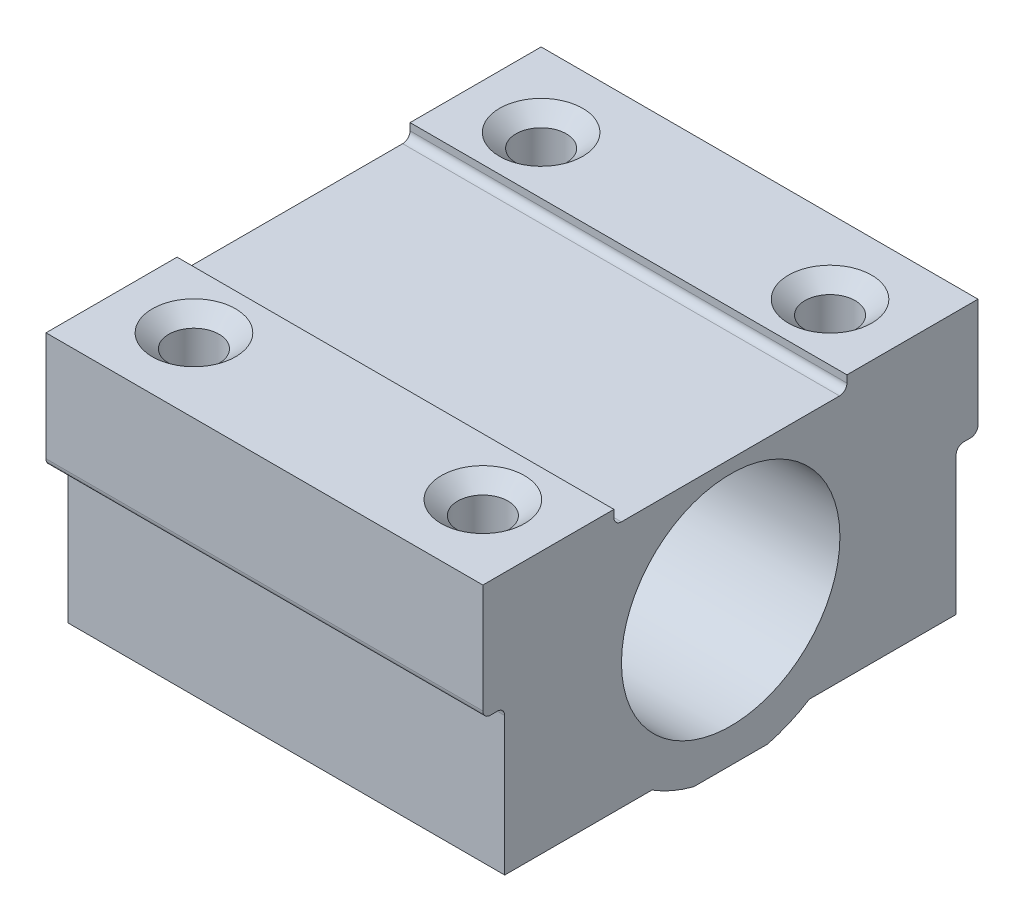
ISO-10303-21;
HEADER;
FILE_DESCRIPTION(('STEP AP214'),'2;1');
FILE_NAME('part.step','',(''),(''),'','','');
FILE_SCHEMA(('AUTOMOTIVE_DESIGN { 1 0 10303 214 1 1 1 1 }'));
ENDSEC;
DATA;
#1=APPLICATION_CONTEXT('core data for automotive mechanical design processes');
#2=APPLICATION_PROTOCOL_DEFINITION('international standard','automotive_design',2000,#1);
#3=PRODUCT_CONTEXT('',#1,'mechanical');
#4=PRODUCT('Part','Part','',(#3));
#5=PRODUCT_RELATED_PRODUCT_CATEGORY('part','',(#4));
#6=PRODUCT_DEFINITION_FORMATION('','',#4);
#7=PRODUCT_DEFINITION_CONTEXT('part definition',#1,'design');
#8=PRODUCT_DEFINITION('design','',#6,#7);
#9=PRODUCT_DEFINITION_SHAPE('','',#8);
#10=(LENGTH_UNIT() NAMED_UNIT(*) SI_UNIT(.MILLI.,.METRE.));
#11=(NAMED_UNIT(*) PLANE_ANGLE_UNIT() SI_UNIT($,.RADIAN.));
#12=(NAMED_UNIT(*) SI_UNIT($,.STERADIAN.) SOLID_ANGLE_UNIT());
#13=UNCERTAINTY_MEASURE_WITH_UNIT(LENGTH_MEASURE(1.E-05),#10,'distance_accuracy_value','');
#14=(GEOMETRIC_REPRESENTATION_CONTEXT(3) GLOBAL_UNCERTAINTY_ASSIGNED_CONTEXT((#13)) GLOBAL_UNIT_ASSIGNED_CONTEXT((#10,
#11,#12)) REPRESENTATION_CONTEXT('',''));
#15=CARTESIAN_POINT('',(0.,0.,0.));
#16=DIRECTION('',(0.,0.,1.));
#17=DIRECTION('',(1.,0.,0.));
#18=AXIS2_PLACEMENT_3D('',#15,#16,#17);
#19=CARTESIAN_POINT('',(30.,8.,0.));
#20=DIRECTION('',(0.,-1.,0.));
#21=DIRECTION('',(0.,0.,-1.));
#22=AXIS2_PLACEMENT_3D('',#19,#20,#21);
#23=PLANE('',#22);
#24=CARTESIAN_POINT('',(24.92,8.,-5.08));
#25=DIRECTION('',(0.,1.,0.));
#26=DIRECTION('',(0.,0.,1.));
#27=AXIS2_PLACEMENT_3D('',#24,#25,#26);
#28=CIRCLE('',#27,2.8575);
#29=CARTESIAN_POINT('',(24.92,8.,-2.2225));
#30=VERTEX_POINT('',#29);
#31=EDGE_CURVE('E225',#30,#30,#28,.T.);
#32=ORIENTED_EDGE('',*,*,#31,.F.);
#33=EDGE_LOOP('',(#32));
#34=FACE_BOUND('',#33,.T.);
#35=DIRECTION('',(0.,0.,1.));
#36=VECTOR('',#35,1.);
#37=CARTESIAN_POINT('',(0.,8.,0.));
#38=LINE('',#37,#36);
#39=CARTESIAN_POINT('',(0.,8.,-9.));
#40=VERTEX_POINT('',#39);
#41=CARTESIAN_POINT('',(0.,8.,0.));
#42=VERTEX_POINT('',#41);
#43=EDGE_CURVE('E320',#40,#42,#38,.T.);
#44=ORIENTED_EDGE('',*,*,#43,.T.);
#45=DIRECTION('',(-1.,0.,0.));
#46=VECTOR('',#45,1.);
#47=CARTESIAN_POINT('',(30.,8.,0.));
#48=LINE('',#47,#46);
#49=CARTESIAN_POINT('',(30.,8.,0.));
#50=VERTEX_POINT('',#49);
#51=EDGE_CURVE('E288',#50,#42,#48,.T.);
#52=ORIENTED_EDGE('',*,*,#51,.F.);
#53=DIRECTION('',(0.,0.,1.));
#54=VECTOR('',#53,1.);
#55=CARTESIAN_POINT('',(30.,8.,0.));
#56=LINE('',#55,#54);
#57=CARTESIAN_POINT('',(30.,8.,-9.));
#58=VERTEX_POINT('',#57);
#59=EDGE_CURVE('E285',#58,#50,#56,.T.);
#60=ORIENTED_EDGE('',*,*,#59,.F.);
#61=DIRECTION('',(-1.,0.,0.));
#62=VECTOR('',#61,1.);
#63=CARTESIAN_POINT('',(30.,8.,-9.));
#64=LINE('',#63,#62);
#65=EDGE_CURVE('E326',#58,#40,#64,.T.);
#66=ORIENTED_EDGE('',*,*,#65,.T.);
#67=EDGE_LOOP('',(#44,#52,#60,#66));
#68=FACE_BOUND('',#67,.T.);
#69=CARTESIAN_POINT('',(5.08,8.,-5.08));
#70=DIRECTION('',(0.,1.,0.));
#71=DIRECTION('',(0.,0.,1.));
#72=AXIS2_PLACEMENT_3D('',#69,#70,#71);
#73=CIRCLE('',#72,2.8575);
#74=CARTESIAN_POINT('',(5.08,8.,-2.2225));
#75=VERTEX_POINT('',#74);
#76=EDGE_CURVE('E234',#75,#75,#73,.T.);
#77=ORIENTED_EDGE('',*,*,#76,.F.);
#78=EDGE_LOOP('',(#77));
#79=FACE_BOUND('',#78,.T.);
#80=ADVANCED_FACE('F39',(#34,#68,#79),#23,.F.);
#81=CARTESIAN_POINT('',(30.,-1.398,-17.018));
#82=DIRECTION('',(1.,0.,0.));
#83=DIRECTION('',(0.,0.,-1.));
#84=AXIS2_PLACEMENT_3D('',#81,#82,#83);
#85=PLANE('',#84);
#86=DIRECTION('',(0.,0.,-1.));
#87=VECTOR('',#86,1.);
#88=CARTESIAN_POINT('',(30.,0.,-32.5));
#89=LINE('',#88,#87);
#90=CARTESIAN_POINT('',(30.,0.,-33.008));
#91=VERTEX_POINT('',#90);
#92=CARTESIAN_POINT('',(30.,0.,-33.492));
#93=VERTEX_POINT('',#92);
#94=EDGE_CURVE('E270',#91,#93,#89,.T.);
#95=ORIENTED_EDGE('',*,*,#94,.T.);
#96=CARTESIAN_POINT('',(30.,0.508,-33.492));
#97=DIRECTION('',(1.,0.,0.));
#98=DIRECTION('',(0.,0.,-1.));
#99=AXIS2_PLACEMENT_3D('',#96,#97,#98);
#100=CIRCLE('',#99,0.508);
#101=CARTESIAN_POINT('',(30.,0.508,-34.));
#102=VERTEX_POINT('',#101);
#103=EDGE_CURVE('E377',#93,#102,#100,.T.);
#104=ORIENTED_EDGE('',*,*,#103,.T.);
#105=DIRECTION('',(0.,1.,0.));
#106=VECTOR('',#105,1.);
#107=CARTESIAN_POINT('',(30.,0.,-34.));
#108=LINE('',#107,#106);
#109=CARTESIAN_POINT('',(30.,8.,-34.));
#110=VERTEX_POINT('',#109);
#111=EDGE_CURVE('E273',#102,#110,#108,.T.);
#112=ORIENTED_EDGE('',*,*,#111,.T.);
#113=DIRECTION('',(0.,0.,1.));
#114=VECTOR('',#113,1.);
#115=CARTESIAN_POINT('',(30.,8.,-34.));
#116=LINE('',#115,#114);
#117=CARTESIAN_POINT('',(30.,8.,-25.));
#118=VERTEX_POINT('',#117);
#119=EDGE_CURVE('E275',#110,#118,#116,.T.);
#120=ORIENTED_EDGE('',*,*,#119,.T.);
#121=DIRECTION('',(0.,-1.,0.));
#122=VECTOR('',#121,1.);
#123=CARTESIAN_POINT('',(30.,7.,-25.));
#124=LINE('',#123,#122);
#125=CARTESIAN_POINT('',(30.,7.508,-25.));
#126=VERTEX_POINT('',#125);
#127=EDGE_CURVE('E277',#118,#126,#124,.T.);
#128=ORIENTED_EDGE('',*,*,#127,.T.);
#129=CARTESIAN_POINT('',(30.,7.508,-24.492));
#130=DIRECTION('',(1.,0.,0.));
#131=DIRECTION('',(0.,0.,-1.));
#132=AXIS2_PLACEMENT_3D('',#129,#130,#131);
#133=CIRCLE('',#132,0.508);
#134=CARTESIAN_POINT('',(30.,7.,-24.492));
#135=VERTEX_POINT('',#134);
#136=EDGE_CURVE('E392',#126,#135,#133,.F.);
#137=ORIENTED_EDGE('',*,*,#136,.T.);
#138=DIRECTION('',(0.,0.,1.));
#139=VECTOR('',#138,1.);
#140=CARTESIAN_POINT('',(30.,7.,-9.));
#141=LINE('',#140,#139);
#142=CARTESIAN_POINT('',(30.,7.,-9.508));
#143=VERTEX_POINT('',#142);
#144=EDGE_CURVE('E280',#135,#143,#141,.T.);
#145=ORIENTED_EDGE('',*,*,#144,.T.);
#146=CARTESIAN_POINT('',(30.,7.508,-9.508));
#147=DIRECTION('',(1.,0.,0.));
#148=DIRECTION('',(0.,0.,-1.));
#149=AXIS2_PLACEMENT_3D('',#146,#147,#148);
#150=CIRCLE('',#149,0.508);
#151=CARTESIAN_POINT('',(30.,7.508,-9.));
#152=VERTEX_POINT('',#151);
#153=EDGE_CURVE('E396',#143,#152,#150,.F.);
#154=ORIENTED_EDGE('',*,*,#153,.T.);
#155=DIRECTION('',(0.,1.,0.));
#156=VECTOR('',#155,1.);
#157=CARTESIAN_POINT('',(30.,7.,-9.));
#158=LINE('',#157,#156);
#159=EDGE_CURVE('E283',#152,#58,#158,.T.);
#160=ORIENTED_EDGE('',*,*,#159,.T.);
#161=ORIENTED_EDGE('',*,*,#59,.T.);
#162=DIRECTION('',(0.,-1.,0.));
#163=VECTOR('',#162,1.);
#164=CARTESIAN_POINT('',(30.,0.,0.));
#165=LINE('',#164,#163);
#166=CARTESIAN_POINT('',(30.,0.508,0.));
#167=VERTEX_POINT('',#166);
#168=EDGE_CURVE('E250',#50,#167,#165,.T.);
#169=ORIENTED_EDGE('',*,*,#168,.T.);
#170=CARTESIAN_POINT('',(30.,0.508,-0.508));
#171=DIRECTION('',(1.,0.,0.));
#172=DIRECTION('',(0.,0.,-1.));
#173=AXIS2_PLACEMENT_3D('',#170,#171,#172);
#174=CIRCLE('',#173,0.508);
#175=CARTESIAN_POINT('',(30.,0.,-0.508));
#176=VERTEX_POINT('',#175);
#177=EDGE_CURVE('E375',#167,#176,#174,.T.);
#178=ORIENTED_EDGE('',*,*,#177,.T.);
#179=DIRECTION('',(0.,0.,-1.));
#180=VECTOR('',#179,1.);
#181=CARTESIAN_POINT('',(30.,0.,0.));
#182=LINE('',#181,#180);
#183=CARTESIAN_POINT('',(30.,0.,-0.992000000000001));
#184=VERTEX_POINT('',#183);
#185=EDGE_CURVE('E253',#176,#184,#182,.T.);
#186=ORIENTED_EDGE('',*,*,#185,.T.);
#187=CARTESIAN_POINT('',(30.,-0.508,-0.992000000000001));
#188=DIRECTION('',(1.,0.,0.));
#189=DIRECTION('',(0.,0.,-1.));
#190=AXIS2_PLACEMENT_3D('',#187,#188,#189);
#191=CIRCLE('',#190,0.508);
#192=CARTESIAN_POINT('',(30.,-0.508,-1.5));
#193=VERTEX_POINT('',#192);
#194=EDGE_CURVE('E11',#184,#193,#191,.F.);
#195=ORIENTED_EDGE('',*,*,#194,.T.);
#196=DIRECTION('',(0.,-1.,0.));
#197=VECTOR('',#196,1.);
#198=CARTESIAN_POINT('',(30.,0.,-1.5));
#199=LINE('',#198,#197);
#200=CARTESIAN_POINT('',(30.,-10.,-1.5));
#201=VERTEX_POINT('',#200);
#202=EDGE_CURVE('E256',#193,#201,#199,.T.);
#203=ORIENTED_EDGE('',*,*,#202,.T.);
#204=DIRECTION('',(0.,0.,-1.));
#205=VECTOR('',#204,1.);
#206=CARTESIAN_POINT('',(30.,-10.,-1.5));
#207=LINE('',#206,#205);
#208=CARTESIAN_POINT('',(30.,-10.,-11.6114117967058));
#209=VERTEX_POINT('',#208);
#210=EDGE_CURVE('E258',#201,#209,#207,.T.);
#211=ORIENTED_EDGE('',*,*,#210,.T.);
#212=CARTESIAN_POINT('',(30.,-1.398,-17.018));
#213=DIRECTION('',(1.,0.,0.));
#214=DIRECTION('',(0.,0.,-1.));
#215=AXIS2_PLACEMENT_3D('',#212,#213,#214);
#216=CIRCLE('',#215,10.16);
#217=CARTESIAN_POINT('',(30.,-11.2375684973966,-14.4865000918347));
#218=VERTEX_POINT('',#217);
#219=EDGE_CURVE('E260',#209,#218,#216,.T.);
#220=ORIENTED_EDGE('',*,*,#219,.T.);
#221=DIRECTION('',(0.,0.,-1.));
#222=VECTOR('',#221,1.);
#223=CARTESIAN_POINT('',(30.,-11.2375684973966,-14.4865000918347));
#224=LINE('',#223,#222);
#225=CARTESIAN_POINT('',(30.,-11.2375684973966,-19.5494999081653));
#226=VERTEX_POINT('',#225);
#227=EDGE_CURVE('E262',#218,#226,#224,.T.);
#228=ORIENTED_EDGE('',*,*,#227,.T.);
#229=CARTESIAN_POINT('',(30.,-1.398,-17.018));
#230=DIRECTION('',(1.,0.,0.));
#231=DIRECTION('',(0.,0.,-1.));
#232=AXIS2_PLACEMENT_3D('',#229,#230,#231);
#233=CIRCLE('',#232,10.16);
#234=CARTESIAN_POINT('',(30.,-10.,-22.4245882032942));
#235=VERTEX_POINT('',#234);
#236=EDGE_CURVE('E264',#226,#235,#233,.T.);
#237=ORIENTED_EDGE('',*,*,#236,.T.);
#238=DIRECTION('',(0.,0.,-1.));
#239=VECTOR('',#238,1.);
#240=CARTESIAN_POINT('',(30.,-10.,-22.4245882032942));
#241=LINE('',#240,#239);
#242=CARTESIAN_POINT('',(30.,-10.,-32.5));
#243=VERTEX_POINT('',#242);
#244=EDGE_CURVE('E266',#235,#243,#241,.T.);
#245=ORIENTED_EDGE('',*,*,#244,.T.);
#246=DIRECTION('',(0.,1.,0.));
#247=VECTOR('',#246,1.);
#248=CARTESIAN_POINT('',(30.,0.,-32.5));
#249=LINE('',#248,#247);
#250=CARTESIAN_POINT('',(30.,-0.508,-32.5));
#251=VERTEX_POINT('',#250);
#252=EDGE_CURVE('E268',#243,#251,#249,.T.);
#253=ORIENTED_EDGE('',*,*,#252,.T.);
#254=CARTESIAN_POINT('',(30.,-0.508,-33.008));
#255=DIRECTION('',(1.,0.,0.));
#256=DIRECTION('',(0.,0.,-1.));
#257=AXIS2_PLACEMENT_3D('',#254,#255,#256);
#258=CIRCLE('',#257,0.508);
#259=EDGE_CURVE('E400',#251,#91,#258,.F.);
#260=ORIENTED_EDGE('',*,*,#259,.T.);
#261=EDGE_LOOP('',(#95,#104,#112,#120,#128,#137,#145,#154,#160,#161,#169,#178,#186,#195,#203,
#211,#220,#228,#237,#245,#253,#260));
#262=FACE_BOUND('',#261,.T.);
#263=CARTESIAN_POINT('',(30.,-1.398,-17.018));
#264=DIRECTION('',(1.,0.,0.));
#265=DIRECTION('',(0.,0.,-1.));
#266=AXIS2_PLACEMENT_3D('',#263,#264,#265);
#267=CIRCLE('',#266,7.5);
#268=CARTESIAN_POINT('',(30.,-1.398,-24.518));
#269=VERTEX_POINT('',#268);
#270=EDGE_CURVE('E244',#269,#269,#267,.T.);
#271=ORIENTED_EDGE('',*,*,#270,.F.);
#272=EDGE_LOOP('',(#271));
#273=FACE_BOUND('',#272,.T.);
#274=ADVANCED_FACE('F419',(#262,#273),#85,.T.);
#275=CARTESIAN_POINT('',(0.,-1.398,-17.018));
#276=DIRECTION('',(1.,0.,0.));
#277=DIRECTION('',(0.,0.,-1.));
#278=AXIS2_PLACEMENT_3D('',#275,#276,#277);
#279=PLANE('',#278);
#280=DIRECTION('',(0.,1.,0.));
#281=VECTOR('',#280,1.);
#282=CARTESIAN_POINT('',(0.,7.49375,-34.));
#283=LINE('',#282,#281);
#284=CARTESIAN_POINT('',(0.,0.508,-34.));
#285=VERTEX_POINT('',#284);
#286=CARTESIAN_POINT('',(0.,8.,-34.));
#287=VERTEX_POINT('',#286);
#288=EDGE_CURVE('E308',#285,#287,#283,.T.);
#289=ORIENTED_EDGE('',*,*,#288,.F.);
#290=CARTESIAN_POINT('',(0.,0.508,-33.492));
#291=DIRECTION('',(1.,0.,0.));
#292=DIRECTION('',(0.,0.,-1.));
#293=AXIS2_PLACEMENT_3D('',#290,#291,#292);
#294=CIRCLE('',#293,0.508);
#295=CARTESIAN_POINT('',(0.,0.,-33.492));
#296=VERTEX_POINT('',#295);
#297=EDGE_CURVE('E368',#285,#296,#294,.F.);
#298=ORIENTED_EDGE('',*,*,#297,.T.);
#299=DIRECTION('',(0.,0.,-1.));
#300=VECTOR('',#299,1.);
#301=CARTESIAN_POINT('',(0.,0.,-32.5));
#302=LINE('',#301,#300);
#303=CARTESIAN_POINT('',(0.,0.,-33.008));
#304=VERTEX_POINT('',#303);
#305=EDGE_CURVE('E305',#304,#296,#302,.T.);
#306=ORIENTED_EDGE('',*,*,#305,.F.);
#307=CARTESIAN_POINT('',(0.,-0.508,-33.008));
#308=DIRECTION('',(1.,0.,0.));
#309=DIRECTION('',(0.,0.,-1.));
#310=AXIS2_PLACEMENT_3D('',#307,#308,#309);
#311=CIRCLE('',#310,0.508);
#312=CARTESIAN_POINT('',(0.,-0.508,-32.5));
#313=VERTEX_POINT('',#312);
#314=EDGE_CURVE('E398',#304,#313,#311,.T.);
#315=ORIENTED_EDGE('',*,*,#314,.T.);
#316=DIRECTION('',(0.,1.,0.));
#317=VECTOR('',#316,1.);
#318=CARTESIAN_POINT('',(0.,0.,-32.5));
#319=LINE('',#318,#317);
#320=CARTESIAN_POINT('',(0.,-10.,-32.5));
#321=VERTEX_POINT('',#320);
#322=EDGE_CURVE('E303',#321,#313,#319,.T.);
#323=ORIENTED_EDGE('',*,*,#322,.F.);
#324=DIRECTION('',(0.,0.,-1.));
#325=VECTOR('',#324,1.);
#326=CARTESIAN_POINT('',(0.,-10.,-22.4245882032942));
#327=LINE('',#326,#325);
#328=CARTESIAN_POINT('',(0.,-10.,-22.4245882032942));
#329=VERTEX_POINT('',#328);
#330=EDGE_CURVE('E301',#329,#321,#327,.T.);
#331=ORIENTED_EDGE('',*,*,#330,.F.);
#332=CARTESIAN_POINT('',(0.,-1.398,-17.018));
#333=DIRECTION('',(1.,0.,0.));
#334=DIRECTION('',(0.,0.,-1.));
#335=AXIS2_PLACEMENT_3D('',#332,#333,#334);
#336=CIRCLE('',#335,10.16);
#337=CARTESIAN_POINT('',(0.,-11.2375684973966,-19.5494999081653));
#338=VERTEX_POINT('',#337);
#339=EDGE_CURVE('E299',#338,#329,#336,.T.);
#340=ORIENTED_EDGE('',*,*,#339,.F.);
#341=DIRECTION('',(0.,0.,-1.));
#342=VECTOR('',#341,1.);
#343=CARTESIAN_POINT('',(0.,-11.2375684973966,-14.4865000918347));
#344=LINE('',#343,#342);
#345=CARTESIAN_POINT('',(0.,-11.2375684973966,-14.4865000918347));
#346=VERTEX_POINT('',#345);
#347=EDGE_CURVE('E297',#346,#338,#344,.T.);
#348=ORIENTED_EDGE('',*,*,#347,.F.);
#349=CARTESIAN_POINT('',(0.,-1.398,-17.018));
#350=DIRECTION('',(1.,0.,0.));
#351=DIRECTION('',(0.,0.,-1.));
#352=AXIS2_PLACEMENT_3D('',#349,#350,#351);
#353=CIRCLE('',#352,10.16);
#354=CARTESIAN_POINT('',(0.,-10.,-11.6114117967058));
#355=VERTEX_POINT('',#354);
#356=EDGE_CURVE('E295',#355,#346,#353,.T.);
#357=ORIENTED_EDGE('',*,*,#356,.F.);
#358=DIRECTION('',(0.,0.,-1.));
#359=VECTOR('',#358,1.);
#360=CARTESIAN_POINT('',(0.,-10.,-1.5));
#361=LINE('',#360,#359);
#362=CARTESIAN_POINT('',(0.,-10.,-1.5));
#363=VERTEX_POINT('',#362);
#364=EDGE_CURVE('E293',#363,#355,#361,.T.);
#365=ORIENTED_EDGE('',*,*,#364,.F.);
#366=DIRECTION('',(0.,-1.,0.));
#367=VECTOR('',#366,1.);
#368=CARTESIAN_POINT('',(0.,0.,-1.5));
#369=LINE('',#368,#367);
#370=CARTESIAN_POINT('',(0.,-0.508,-1.5));
#371=VERTEX_POINT('',#370);
#372=EDGE_CURVE('E291',#371,#363,#369,.T.);
#373=ORIENTED_EDGE('',*,*,#372,.F.);
#374=CARTESIAN_POINT('',(0.,-0.508,-0.992000000000001));
#375=DIRECTION('',(1.,0.,0.));
#376=DIRECTION('',(0.,0.,-1.));
#377=AXIS2_PLACEMENT_3D('',#374,#375,#376);
#378=CIRCLE('',#377,0.508);
#379=CARTESIAN_POINT('',(0.,0.,-0.992000000000001));
#380=VERTEX_POINT('',#379);
#381=EDGE_CURVE('E47',#371,#380,#378,.T.);
#382=ORIENTED_EDGE('',*,*,#381,.T.);
#383=DIRECTION('',(0.,0.,-1.));
#384=VECTOR('',#383,1.);
#385=CARTESIAN_POINT('',(0.,0.,0.));
#386=LINE('',#385,#384);
#387=CARTESIAN_POINT('',(0.,0.,-0.508));
#388=VERTEX_POINT('',#387);
#389=EDGE_CURVE('E247',#388,#380,#386,.T.);
#390=ORIENTED_EDGE('',*,*,#389,.F.);
#391=CARTESIAN_POINT('',(0.,0.508,-0.508));
#392=DIRECTION('',(1.,0.,0.));
#393=DIRECTION('',(0.,0.,-1.));
#394=AXIS2_PLACEMENT_3D('',#391,#392,#393);
#395=CIRCLE('',#394,0.508);
#396=CARTESIAN_POINT('',(0.,0.508,0.));
#397=VERTEX_POINT('',#396);
#398=EDGE_CURVE('E366',#388,#397,#395,.F.);
#399=ORIENTED_EDGE('',*,*,#398,.T.);
#400=DIRECTION('',(0.,-1.,0.));
#401=VECTOR('',#400,1.);
#402=CARTESIAN_POINT('',(0.,7.49375,0.));
#403=LINE('',#402,#401);
#404=EDGE_CURVE('E254',#42,#397,#403,.T.);
#405=ORIENTED_EDGE('',*,*,#404,.F.);
#406=ORIENTED_EDGE('',*,*,#43,.F.);
#407=DIRECTION('',(0.,1.,0.));
#408=VECTOR('',#407,1.);
#409=CARTESIAN_POINT('',(0.,7.,-9.));
#410=LINE('',#409,#408);
#411=CARTESIAN_POINT('',(0.,7.508,-9.));
#412=VERTEX_POINT('',#411);
#413=EDGE_CURVE('E318',#412,#40,#410,.T.);
#414=ORIENTED_EDGE('',*,*,#413,.F.);
#415=CARTESIAN_POINT('',(0.,7.508,-9.508));
#416=DIRECTION('',(1.,0.,0.));
#417=DIRECTION('',(0.,0.,-1.));
#418=AXIS2_PLACEMENT_3D('',#415,#416,#417);
#419=CIRCLE('',#418,0.508);
#420=CARTESIAN_POINT('',(0.,7.,-9.508));
#421=VERTEX_POINT('',#420);
#422=EDGE_CURVE('E394',#412,#421,#419,.T.);
#423=ORIENTED_EDGE('',*,*,#422,.T.);
#424=DIRECTION('',(0.,0.,1.));
#425=VECTOR('',#424,1.);
#426=CARTESIAN_POINT('',(0.,7.,-9.));
#427=LINE('',#426,#425);
#428=CARTESIAN_POINT('',(0.,7.,-24.492));
#429=VERTEX_POINT('',#428);
#430=EDGE_CURVE('E315',#429,#421,#427,.T.);
#431=ORIENTED_EDGE('',*,*,#430,.F.);
#432=CARTESIAN_POINT('',(0.,7.508,-24.492));
#433=DIRECTION('',(1.,0.,0.));
#434=DIRECTION('',(0.,0.,-1.));
#435=AXIS2_PLACEMENT_3D('',#432,#433,#434);
#436=CIRCLE('',#435,0.508);
#437=CARTESIAN_POINT('',(0.,7.508,-25.));
#438=VERTEX_POINT('',#437);
#439=EDGE_CURVE('E390',#429,#438,#436,.T.);
#440=ORIENTED_EDGE('',*,*,#439,.T.);
#441=DIRECTION('',(0.,-1.,0.));
#442=VECTOR('',#441,1.);
#443=CARTESIAN_POINT('',(0.,7.,-25.));
#444=LINE('',#443,#442);
#445=CARTESIAN_POINT('',(0.,8.,-25.));
#446=VERTEX_POINT('',#445);
#447=EDGE_CURVE('E312',#446,#438,#444,.T.);
#448=ORIENTED_EDGE('',*,*,#447,.F.);
#449=DIRECTION('',(0.,0.,1.));
#450=VECTOR('',#449,1.);
#451=CARTESIAN_POINT('',(0.,8.,-34.));
#452=LINE('',#451,#450);
#453=EDGE_CURVE('E310',#287,#446,#452,.T.);
#454=ORIENTED_EDGE('',*,*,#453,.F.);
#455=EDGE_LOOP('',(#289,#298,#306,#315,#323,#331,#340,#348,#357,#365,#373,#382,#390,#399,#405,
#406,#414,#423,#431,#440,#448,#454));
#456=FACE_BOUND('',#455,.T.);
#457=CARTESIAN_POINT('',(0.,-1.398,-17.018));
#458=DIRECTION('',(1.,0.,0.));
#459=DIRECTION('',(0.,0.,-1.));
#460=AXIS2_PLACEMENT_3D('',#457,#458,#459);
#461=CIRCLE('',#460,7.5);
#462=CARTESIAN_POINT('',(0.,-1.398,-24.518));
#463=VERTEX_POINT('',#462);
#464=EDGE_CURVE('E243',#463,#463,#461,.T.);
#465=ORIENTED_EDGE('',*,*,#464,.T.);
#466=EDGE_LOOP('',(#465));
#467=FACE_BOUND('',#466,.T.);
#468=ADVANCED_FACE('F405',(#456,#467),#279,.F.);
#469=CARTESIAN_POINT('',(30.,0.,0.));
#470=DIRECTION('',(0.,1.,0.));
#471=DIRECTION('',(0.,0.,1.));
#472=AXIS2_PLACEMENT_3D('',#469,#470,#471);
#473=PLANE('',#472);
#474=ORIENTED_EDGE('',*,*,#185,.F.);
#475=DIRECTION('',(-1.,0.,0.));
#476=VECTOR('',#475,1.);
#477=CARTESIAN_POINT('',(30.,0.,-0.508));
#478=LINE('',#477,#476);
#479=EDGE_CURVE('E382',#176,#388,#478,.T.);
#480=ORIENTED_EDGE('',*,*,#479,.T.);
#481=ORIENTED_EDGE('',*,*,#389,.T.);
#482=DIRECTION('',(-1.,0.,0.));
#483=VECTOR('',#482,1.);
#484=CARTESIAN_POINT('',(30.,0.,-0.992000000000001));
#485=LINE('',#484,#483);
#486=EDGE_CURVE('E380',#380,#184,#485,.F.);
#487=ORIENTED_EDGE('',*,*,#486,.T.);
#488=EDGE_LOOP('',(#474,#480,#481,#487));
#489=FACE_BOUND('',#488,.T.);
#490=ADVANCED_FACE('F413',(#489),#473,.F.);
#491=CARTESIAN_POINT('',(30.,0.,-1.5));
#492=DIRECTION('',(0.,0.,-1.));
#493=DIRECTION('',(0.,1.,0.));
#494=AXIS2_PLACEMENT_3D('',#491,#492,#493);
#495=PLANE('',#494);
#496=ORIENTED_EDGE('',*,*,#202,.F.);
#497=DIRECTION('',(-1.,0.,0.));
#498=VECTOR('',#497,1.);
#499=CARTESIAN_POINT('',(0.,-0.508,-1.5));
#500=LINE('',#499,#498);
#501=EDGE_CURVE('E387',#193,#371,#500,.T.);
#502=ORIENTED_EDGE('',*,*,#501,.T.);
#503=ORIENTED_EDGE('',*,*,#372,.T.);
#504=DIRECTION('',(-1.,0.,0.));
#505=VECTOR('',#504,1.);
#506=CARTESIAN_POINT('',(30.,-10.,-1.5));
#507=LINE('',#506,#505);
#508=EDGE_CURVE('E350',#201,#363,#507,.T.);
#509=ORIENTED_EDGE('',*,*,#508,.F.);
#510=EDGE_LOOP('',(#496,#502,#503,#509));
#511=FACE_BOUND('',#510,.T.);
#512=ADVANCED_FACE('F416',(#511),#495,.F.);
#513=CARTESIAN_POINT('',(30.,-10.,-1.5));
#514=DIRECTION('',(0.,1.,0.));
#515=DIRECTION('',(0.,0.,1.));
#516=AXIS2_PLACEMENT_3D('',#513,#514,#515);
#517=PLANE('',#516);
#518=ORIENTED_EDGE('',*,*,#364,.T.);
#519=DIRECTION('',(-1.,0.,0.));
#520=VECTOR('',#519,1.);
#521=CARTESIAN_POINT('',(30.,-10.,-11.6114117967058));
#522=LINE('',#521,#520);
#523=EDGE_CURVE('E347',#209,#355,#522,.T.);
#524=ORIENTED_EDGE('',*,*,#523,.F.);
#525=ORIENTED_EDGE('',*,*,#210,.F.);
#526=ORIENTED_EDGE('',*,*,#508,.T.);
#527=EDGE_LOOP('',(#518,#524,#525,#526));
#528=FACE_BOUND('',#527,.T.);
#529=ADVANCED_FACE('F425',(#528),#517,.F.);
#530=CARTESIAN_POINT('',(30.,-1.398,-17.018));
#531=DIRECTION('',(-1.,0.,0.));
#532=DIRECTION('',(0.,0.,1.));
#533=AXIS2_PLACEMENT_3D('',#530,#531,#532);
#534=CYLINDRICAL_SURFACE('',#533,10.16);
#535=ORIENTED_EDGE('',*,*,#356,.T.);
#536=DIRECTION('',(-1.,0.,0.));
#537=VECTOR('',#536,1.);
#538=CARTESIAN_POINT('',(30.,-11.2375684973966,-14.4865000918347));
#539=LINE('',#538,#537);
#540=EDGE_CURVE('E344',#218,#346,#539,.T.);
#541=ORIENTED_EDGE('',*,*,#540,.F.);
#542=ORIENTED_EDGE('',*,*,#219,.F.);
#543=ORIENTED_EDGE('',*,*,#523,.T.);
#544=EDGE_LOOP('',(#535,#541,#542,#543));
#545=FACE_BOUND('',#544,.T.);
#546=ADVANCED_FACE('F428',(#545),#534,.T.);
#547=CARTESIAN_POINT('',(30.,-11.2375684973966,-14.4865000918347));
#548=DIRECTION('',(0.,1.,0.));
#549=DIRECTION('',(0.,0.,1.));
#550=AXIS2_PLACEMENT_3D('',#547,#548,#549);
#551=PLANE('',#550);
#552=ORIENTED_EDGE('',*,*,#347,.T.);
#553=DIRECTION('',(-1.,0.,0.));
#554=VECTOR('',#553,1.);
#555=CARTESIAN_POINT('',(30.,-11.2375684973966,-19.5494999081653));
#556=LINE('',#555,#554);
#557=EDGE_CURVE('E341',#226,#338,#556,.T.);
#558=ORIENTED_EDGE('',*,*,#557,.F.);
#559=ORIENTED_EDGE('',*,*,#227,.F.);
#560=ORIENTED_EDGE('',*,*,#540,.T.);
#561=EDGE_LOOP('',(#552,#558,#559,#560));
#562=FACE_BOUND('',#561,.T.);
#563=ADVANCED_FACE('F433',(#562),#551,.F.);
#564=CARTESIAN_POINT('',(30.,-1.398,-17.018));
#565=DIRECTION('',(-1.,0.,0.));
#566=DIRECTION('',(0.,0.,1.));
#567=AXIS2_PLACEMENT_3D('',#564,#565,#566);
#568=CYLINDRICAL_SURFACE('',#567,10.16);
#569=ORIENTED_EDGE('',*,*,#339,.T.);
#570=DIRECTION('',(-1.,0.,0.));
#571=VECTOR('',#570,1.);
#572=CARTESIAN_POINT('',(30.,-10.,-22.4245882032942));
#573=LINE('',#572,#571);
#574=EDGE_CURVE('E338',#235,#329,#573,.T.);
#575=ORIENTED_EDGE('',*,*,#574,.F.);
#576=ORIENTED_EDGE('',*,*,#236,.F.);
#577=ORIENTED_EDGE('',*,*,#557,.T.);
#578=EDGE_LOOP('',(#569,#575,#576,#577));
#579=FACE_BOUND('',#578,.T.);
#580=ADVANCED_FACE('F439',(#579),#568,.T.);
#581=CARTESIAN_POINT('',(30.,-10.,-22.4245882032942));
#582=DIRECTION('',(0.,1.,0.));
#583=DIRECTION('',(0.,0.,1.));
#584=AXIS2_PLACEMENT_3D('',#581,#582,#583);
#585=PLANE('',#584);
#586=ORIENTED_EDGE('',*,*,#330,.T.);
#587=DIRECTION('',(-1.,0.,0.));
#588=VECTOR('',#587,1.);
#589=CARTESIAN_POINT('',(30.,-10.,-32.5));
#590=LINE('',#589,#588);
#591=EDGE_CURVE('E335',#243,#321,#590,.T.);
#592=ORIENTED_EDGE('',*,*,#591,.F.);
#593=ORIENTED_EDGE('',*,*,#244,.F.);
#594=ORIENTED_EDGE('',*,*,#574,.T.);
#595=EDGE_LOOP('',(#586,#592,#593,#594));
#596=FACE_BOUND('',#595,.T.);
#597=ADVANCED_FACE('F443',(#596),#585,.F.);
#598=CARTESIAN_POINT('',(30.,0.,-32.5));
#599=DIRECTION('',(0.,0.,1.));
#600=DIRECTION('',(1.,0.,0.));
#601=AXIS2_PLACEMENT_3D('',#598,#599,#600);
#602=PLANE('',#601);
#603=ORIENTED_EDGE('',*,*,#322,.T.);
#604=DIRECTION('',(-1.,0.,0.));
#605=VECTOR('',#604,1.);
#606=CARTESIAN_POINT('',(30.,-0.508,-32.5));
#607=LINE('',#606,#605);
#608=EDGE_CURVE('E54',#313,#251,#607,.F.);
#609=ORIENTED_EDGE('',*,*,#608,.T.);
#610=ORIENTED_EDGE('',*,*,#252,.F.);
#611=ORIENTED_EDGE('',*,*,#591,.T.);
#612=EDGE_LOOP('',(#603,#609,#610,#611));
#613=FACE_BOUND('',#612,.T.);
#614=ADVANCED_FACE('F445',(#613),#602,.F.);
#615=CARTESIAN_POINT('',(30.,0.,-32.5));
#616=DIRECTION('',(0.,1.,0.));
#617=DIRECTION('',(0.,0.,1.));
#618=AXIS2_PLACEMENT_3D('',#615,#616,#617);
#619=PLANE('',#618);
#620=ORIENTED_EDGE('',*,*,#305,.T.);
#621=DIRECTION('',(-1.,0.,0.));
#622=VECTOR('',#621,1.);
#623=CARTESIAN_POINT('',(30.,0.,-33.492));
#624=LINE('',#623,#622);
#625=EDGE_CURVE('E373',#296,#93,#624,.F.);
#626=ORIENTED_EDGE('',*,*,#625,.T.);
#627=ORIENTED_EDGE('',*,*,#94,.F.);
#628=DIRECTION('',(-1.,0.,0.));
#629=VECTOR('',#628,1.);
#630=CARTESIAN_POINT('',(0.,0.,-33.008));
#631=LINE('',#630,#629);
#632=EDGE_CURVE('E370',#91,#304,#631,.T.);
#633=ORIENTED_EDGE('',*,*,#632,.T.);
#634=EDGE_LOOP('',(#620,#626,#627,#633));
#635=FACE_BOUND('',#634,.T.);
#636=ADVANCED_FACE('F453',(#635),#619,.F.);
#637=CARTESIAN_POINT('',(30.,7.49375,-34.));
#638=DIRECTION('',(0.,0.,1.));
#639=DIRECTION('',(1.,0.,0.));
#640=AXIS2_PLACEMENT_3D('',#637,#638,#639);
#641=PLANE('',#640);
#642=ORIENTED_EDGE('',*,*,#111,.F.);
#643=DIRECTION('',(-1.,0.,0.));
#644=VECTOR('',#643,1.);
#645=CARTESIAN_POINT('',(30.,0.508,-34.));
#646=LINE('',#645,#644);
#647=EDGE_CURVE('E363',#102,#285,#646,.T.);
#648=ORIENTED_EDGE('',*,*,#647,.T.);
#649=ORIENTED_EDGE('',*,*,#288,.T.);
#650=DIRECTION('',(-1.,0.,0.));
#651=VECTOR('',#650,1.);
#652=CARTESIAN_POINT('',(30.,8.,-34.));
#653=LINE('',#652,#651);
#654=EDGE_CURVE('E332',#110,#287,#653,.T.);
#655=ORIENTED_EDGE('',*,*,#654,.F.);
#656=EDGE_LOOP('',(#642,#648,#649,#655));
#657=FACE_BOUND('',#656,.T.);
#658=ADVANCED_FACE('F462',(#657),#641,.F.);
#659=CARTESIAN_POINT('',(30.,8.,-34.));
#660=DIRECTION('',(0.,-1.,0.));
#661=DIRECTION('',(0.,0.,-1.));
#662=AXIS2_PLACEMENT_3D('',#659,#660,#661);
#663=PLANE('',#662);
#664=CARTESIAN_POINT('',(5.08,8.,-28.92));
#665=DIRECTION('',(0.,1.,0.));
#666=DIRECTION('',(0.,0.,1.));
#667=AXIS2_PLACEMENT_3D('',#664,#665,#666);
#668=CIRCLE('',#667,2.8575);
#669=CARTESIAN_POINT('',(5.08,8.,-26.0625));
#670=VERTEX_POINT('',#669);
#671=EDGE_CURVE('E216',#670,#670,#668,.T.);
#672=ORIENTED_EDGE('',*,*,#671,.F.);
#673=EDGE_LOOP('',(#672));
#674=FACE_BOUND('',#673,.T.);
#675=CARTESIAN_POINT('',(24.92,8.,-28.92));
#676=DIRECTION('',(0.,1.,0.));
#677=DIRECTION('',(0.,0.,1.));
#678=AXIS2_PLACEMENT_3D('',#675,#676,#677);
#679=CIRCLE('',#678,2.8575);
#680=CARTESIAN_POINT('',(24.92,8.,-26.0625));
#681=VERTEX_POINT('',#680);
#682=EDGE_CURVE('E209',#681,#681,#679,.T.);
#683=ORIENTED_EDGE('',*,*,#682,.F.);
#684=EDGE_LOOP('',(#683));
#685=FACE_BOUND('',#684,.T.);
#686=ORIENTED_EDGE('',*,*,#453,.T.);
#687=DIRECTION('',(-1.,0.,0.));
#688=VECTOR('',#687,1.);
#689=CARTESIAN_POINT('',(30.,8.,-25.));
#690=LINE('',#689,#688);
#691=EDGE_CURVE('E329',#118,#446,#690,.T.);
#692=ORIENTED_EDGE('',*,*,#691,.F.);
#693=ORIENTED_EDGE('',*,*,#119,.F.);
#694=ORIENTED_EDGE('',*,*,#654,.T.);
#695=EDGE_LOOP('',(#686,#692,#693,#694));
#696=FACE_BOUND('',#695,.T.);
#697=ADVANCED_FACE('F469',(#674,#685,#696),#663,.F.);
#698=CARTESIAN_POINT('',(30.,7.,-25.));
#699=DIRECTION('',(0.,0.,-1.));
#700=DIRECTION('',(-1.,0.,0.));
#701=AXIS2_PLACEMENT_3D('',#698,#699,#700);
#702=PLANE('',#701);
#703=ORIENTED_EDGE('',*,*,#447,.T.);
#704=DIRECTION('',(-1.,0.,0.));
#705=VECTOR('',#704,1.);
#706=CARTESIAN_POINT('',(30.,7.508,-25.));
#707=LINE('',#706,#705);
#708=EDGE_CURVE('E358',#438,#126,#707,.F.);
#709=ORIENTED_EDGE('',*,*,#708,.T.);
#710=ORIENTED_EDGE('',*,*,#127,.F.);
#711=ORIENTED_EDGE('',*,*,#691,.T.);
#712=EDGE_LOOP('',(#703,#709,#710,#711));
#713=FACE_BOUND('',#712,.T.);
#714=ADVANCED_FACE('F472',(#713),#702,.F.);
#715=CARTESIAN_POINT('',(30.,7.,-9.));
#716=DIRECTION('',(0.,-1.,0.));
#717=DIRECTION('',(0.,0.,-1.));
#718=AXIS2_PLACEMENT_3D('',#715,#716,#717);
#719=PLANE('',#718);
#720=ORIENTED_EDGE('',*,*,#144,.F.);
#721=DIRECTION('',(-1.,0.,0.));
#722=VECTOR('',#721,1.);
#723=CARTESIAN_POINT('',(0.,7.,-24.492));
#724=LINE('',#723,#722);
#725=EDGE_CURVE('E355',#135,#429,#724,.T.);
#726=ORIENTED_EDGE('',*,*,#725,.T.);
#727=ORIENTED_EDGE('',*,*,#430,.T.);
#728=DIRECTION('',(-1.,0.,0.));
#729=VECTOR('',#728,1.);
#730=CARTESIAN_POINT('',(30.,7.,-9.508));
#731=LINE('',#730,#729);
#732=EDGE_CURVE('E353',#421,#143,#731,.F.);
#733=ORIENTED_EDGE('',*,*,#732,.T.);
#734=EDGE_LOOP('',(#720,#726,#727,#733));
#735=FACE_BOUND('',#734,.T.);
#736=ADVANCED_FACE('F480',(#735),#719,.F.);
#737=CARTESIAN_POINT('',(30.,7.,-9.));
#738=DIRECTION('',(0.,0.,1.));
#739=DIRECTION('',(1.,0.,0.));
#740=AXIS2_PLACEMENT_3D('',#737,#738,#739);
#741=PLANE('',#740);
#742=ORIENTED_EDGE('',*,*,#159,.F.);
#743=DIRECTION('',(-1.,0.,0.));
#744=VECTOR('',#743,1.);
#745=CARTESIAN_POINT('',(0.,7.508,-9.));
#746=LINE('',#745,#744);
#747=EDGE_CURVE('E360',#152,#412,#746,.T.);
#748=ORIENTED_EDGE('',*,*,#747,.T.);
#749=ORIENTED_EDGE('',*,*,#413,.T.);
#750=ORIENTED_EDGE('',*,*,#65,.F.);
#751=EDGE_LOOP('',(#742,#748,#749,#750));
#752=FACE_BOUND('',#751,.T.);
#753=ADVANCED_FACE('F489',(#752),#741,.F.);
#754=CARTESIAN_POINT('',(30.,7.49375,0.));
#755=DIRECTION('',(0.,0.,-1.));
#756=DIRECTION('',(-1.,0.,0.));
#757=AXIS2_PLACEMENT_3D('',#754,#755,#756);
#758=PLANE('',#757);
#759=ORIENTED_EDGE('',*,*,#404,.T.);
#760=DIRECTION('',(-1.,0.,0.));
#761=VECTOR('',#760,1.);
#762=CARTESIAN_POINT('',(30.,0.508,0.));
#763=LINE('',#762,#761);
#764=EDGE_CURVE('E385',#397,#167,#763,.F.);
#765=ORIENTED_EDGE('',*,*,#764,.T.);
#766=ORIENTED_EDGE('',*,*,#168,.F.);
#767=ORIENTED_EDGE('',*,*,#51,.T.);
#768=EDGE_LOOP('',(#759,#765,#766,#767));
#769=FACE_BOUND('',#768,.T.);
#770=ADVANCED_FACE('F502',(#769),#758,.F.);
#771=CARTESIAN_POINT('',(30.,-1.398,-17.018));
#772=DIRECTION('',(-1.,0.,0.));
#773=DIRECTION('',(0.,0.,1.));
#774=AXIS2_PLACEMENT_3D('',#771,#772,#773);
#775=CYLINDRICAL_SURFACE('',#774,7.5);
#776=ORIENTED_EDGE('',*,*,#270,.T.);
#777=EDGE_LOOP('',(#776));
#778=FACE_BOUND('',#777,.T.);
#779=ORIENTED_EDGE('',*,*,#464,.F.);
#780=EDGE_LOOP('',(#779));
#781=FACE_BOUND('',#780,.T.);
#782=ADVANCED_FACE('F504',(#778,#781),#775,.F.);
#783=CARTESIAN_POINT('',(5.08,1.65,-5.08));
#784=DIRECTION('',(0.,1.,0.));
#785=DIRECTION('',(0.,0.,1.));
#786=AXIS2_PLACEMENT_3D('',#783,#784,#785);
#787=CONICAL_SURFACE('',#786,1.7272,1.02974425867665);
#788=CARTESIAN_POINT('',(5.08,0.612193538815598,-5.08));
#789=VERTEX_POINT('',#788);
#790=VERTEX_LOOP('',#789);
#791=FACE_BOUND('',#790,.T.);
#792=CARTESIAN_POINT('',(5.08,1.65,-5.08));
#793=DIRECTION('',(0.,1.,0.));
#794=DIRECTION('',(0.,0.,1.));
#795=AXIS2_PLACEMENT_3D('',#792,#793,#794);
#796=CIRCLE('',#795,1.7272);
#797=CARTESIAN_POINT('',(5.08,1.65,-3.3528));
#798=VERTEX_POINT('',#797);
#799=EDGE_CURVE('E240',#798,#798,#796,.T.);
#800=ORIENTED_EDGE('',*,*,#799,.T.);
#801=EDGE_LOOP('',(#800));
#802=FACE_BOUND('',#801,.T.);
#803=ADVANCED_FACE('F511',(#791,#802),#787,.F.);
#804=CARTESIAN_POINT('',(5.08,8.,-5.08));
#805=DIRECTION('',(0.,1.,0.));
#806=DIRECTION('',(0.,0.,1.));
#807=AXIS2_PLACEMENT_3D('',#804,#805,#806);
#808=CYLINDRICAL_SURFACE('',#807,1.7272);
#809=ORIENTED_EDGE('',*,*,#799,.F.);
#810=EDGE_LOOP('',(#809));
#811=FACE_BOUND('',#810,.T.);
#812=CARTESIAN_POINT('',(5.08,7.05156568688032,-5.08));
#813=DIRECTION('',(0.,1.,0.));
#814=DIRECTION('',(0.,0.,1.));
#815=AXIS2_PLACEMENT_3D('',#812,#813,#814);
#816=CIRCLE('',#815,1.7272);
#817=CARTESIAN_POINT('',(5.08,7.05156568688032,-3.3528));
#818=VERTEX_POINT('',#817);
#819=EDGE_CURVE('E237',#818,#818,#816,.T.);
#820=ORIENTED_EDGE('',*,*,#819,.T.);
#821=EDGE_LOOP('',(#820));
#822=FACE_BOUND('',#821,.T.);
#823=ADVANCED_FACE('F655',(#811,#822),#808,.F.);
#824=CARTESIAN_POINT('',(5.08,8.,-5.08));
#825=DIRECTION('',(0.,1.,0.));
#826=DIRECTION('',(0.,0.,1.));
#827=AXIS2_PLACEMENT_3D('',#824,#825,#826);
#828=CONICAL_SURFACE('',#827,2.8575,0.872664625997164);
#829=ORIENTED_EDGE('',*,*,#819,.F.);
#830=EDGE_LOOP('',(#829));
#831=FACE_BOUND('',#830,.T.);
#832=ORIENTED_EDGE('',*,*,#76,.T.);
#833=EDGE_LOOP('',(#832));
#834=FACE_BOUND('',#833,.T.);
#835=ADVANCED_FACE('F647',(#831,#834),#828,.F.);
#836=CARTESIAN_POINT('',(24.92,1.65,-5.08));
#837=DIRECTION('',(0.,1.,0.));
#838=DIRECTION('',(0.,0.,1.));
#839=AXIS2_PLACEMENT_3D('',#836,#837,#838);
#840=CONICAL_SURFACE('',#839,1.7272,1.02974425867665);
#841=CARTESIAN_POINT('',(24.92,0.612193538815598,-5.08));
#842=VERTEX_POINT('',#841);
#843=VERTEX_LOOP('',#842);
#844=FACE_BOUND('',#843,.T.);
#845=CARTESIAN_POINT('',(24.92,1.65,-5.08));
#846=DIRECTION('',(0.,1.,0.));
#847=DIRECTION('',(0.,0.,1.));
#848=AXIS2_PLACEMENT_3D('',#845,#846,#847);
#849=CIRCLE('',#848,1.7272);
#850=CARTESIAN_POINT('',(24.92,1.65,-3.3528));
#851=VERTEX_POINT('',#850);
#852=EDGE_CURVE('E231',#851,#851,#849,.T.);
#853=ORIENTED_EDGE('',*,*,#852,.T.);
#854=EDGE_LOOP('',(#853));
#855=FACE_BOUND('',#854,.T.);
#856=ADVANCED_FACE('F639',(#844,#855),#840,.F.);
#857=CARTESIAN_POINT('',(24.92,8.,-5.08));
#858=DIRECTION('',(0.,1.,0.));
#859=DIRECTION('',(0.,0.,1.));
#860=AXIS2_PLACEMENT_3D('',#857,#858,#859);
#861=CYLINDRICAL_SURFACE('',#860,1.7272);
#862=ORIENTED_EDGE('',*,*,#852,.F.);
#863=EDGE_LOOP('',(#862));
#864=FACE_BOUND('',#863,.T.);
#865=CARTESIAN_POINT('',(24.92,7.05156568688032,-5.08));
#866=DIRECTION('',(0.,1.,0.));
#867=DIRECTION('',(0.,0.,1.));
#868=AXIS2_PLACEMENT_3D('',#865,#866,#867);
#869=CIRCLE('',#868,1.7272);
#870=CARTESIAN_POINT('',(24.92,7.05156568688032,-3.3528));
#871=VERTEX_POINT('',#870);
#872=EDGE_CURVE('E228',#871,#871,#869,.T.);
#873=ORIENTED_EDGE('',*,*,#872,.T.);
#874=EDGE_LOOP('',(#873));
#875=FACE_BOUND('',#874,.T.);
#876=ADVANCED_FACE('F631',(#864,#875),#861,.F.);
#877=CARTESIAN_POINT('',(24.92,8.,-5.08));
#878=DIRECTION('',(0.,1.,0.));
#879=DIRECTION('',(0.,0.,1.));
#880=AXIS2_PLACEMENT_3D('',#877,#878,#879);
#881=CONICAL_SURFACE('',#880,2.8575,0.872664625997164);
#882=ORIENTED_EDGE('',*,*,#872,.F.);
#883=EDGE_LOOP('',(#882));
#884=FACE_BOUND('',#883,.T.);
#885=ORIENTED_EDGE('',*,*,#31,.T.);
#886=EDGE_LOOP('',(#885));
#887=FACE_BOUND('',#886,.T.);
#888=ADVANCED_FACE('F623',(#884,#887),#881,.F.);
#889=CARTESIAN_POINT('',(24.92,1.65,-28.92));
#890=DIRECTION('',(0.,1.,0.));
#891=DIRECTION('',(0.,0.,1.));
#892=AXIS2_PLACEMENT_3D('',#889,#890,#891);
#893=CONICAL_SURFACE('',#892,1.7272,1.02974425867665);
#894=CARTESIAN_POINT('',(24.92,0.612193538815598,-28.92));
#895=VERTEX_POINT('',#894);
#896=VERTEX_LOOP('',#895);
#897=FACE_BOUND('',#896,.T.);
#898=CARTESIAN_POINT('',(24.92,1.65,-28.92));
#899=DIRECTION('',(0.,1.,0.));
#900=DIRECTION('',(0.,0.,1.));
#901=AXIS2_PLACEMENT_3D('',#898,#899,#900);
#902=CIRCLE('',#901,1.7272);
#903=CARTESIAN_POINT('',(24.92,1.65,-27.1928));
#904=VERTEX_POINT('',#903);
#905=EDGE_CURVE('E222',#904,#904,#902,.T.);
#906=ORIENTED_EDGE('',*,*,#905,.T.);
#907=EDGE_LOOP('',(#906));
#908=FACE_BOUND('',#907,.T.);
#909=ADVANCED_FACE('F615',(#897,#908),#893,.F.);
#910=CARTESIAN_POINT('',(24.92,8.,-28.92));
#911=DIRECTION('',(0.,1.,0.));
#912=DIRECTION('',(0.,0.,1.));
#913=AXIS2_PLACEMENT_3D('',#910,#911,#912);
#914=CYLINDRICAL_SURFACE('',#913,1.7272);
#915=ORIENTED_EDGE('',*,*,#905,.F.);
#916=EDGE_LOOP('',(#915));
#917=FACE_BOUND('',#916,.T.);
#918=CARTESIAN_POINT('',(24.92,7.05156568688032,-28.92));
#919=DIRECTION('',(0.,1.,0.));
#920=DIRECTION('',(0.,0.,1.));
#921=AXIS2_PLACEMENT_3D('',#918,#919,#920);
#922=CIRCLE('',#921,1.7272);
#923=CARTESIAN_POINT('',(24.92,7.05156568688032,-27.1928));
#924=VERTEX_POINT('',#923);
#925=EDGE_CURVE('E213',#924,#924,#922,.T.);
#926=ORIENTED_EDGE('',*,*,#925,.T.);
#927=EDGE_LOOP('',(#926));
#928=FACE_BOUND('',#927,.T.);
#929=ADVANCED_FACE('F607',(#917,#928),#914,.F.);
#930=CARTESIAN_POINT('',(24.92,8.,-28.92));
#931=DIRECTION('',(0.,1.,0.));
#932=DIRECTION('',(0.,0.,1.));
#933=AXIS2_PLACEMENT_3D('',#930,#931,#932);
#934=CONICAL_SURFACE('',#933,2.8575,0.872664625997164);
#935=ORIENTED_EDGE('',*,*,#925,.F.);
#936=EDGE_LOOP('',(#935));
#937=FACE_BOUND('',#936,.T.);
#938=ORIENTED_EDGE('',*,*,#682,.T.);
#939=EDGE_LOOP('',(#938));
#940=FACE_BOUND('',#939,.T.);
#941=ADVANCED_FACE('F203',(#937,#940),#934,.F.);
#942=CARTESIAN_POINT('',(5.08,1.65,-28.92));
#943=DIRECTION('',(0.,1.,0.));
#944=DIRECTION('',(0.,0.,1.));
#945=AXIS2_PLACEMENT_3D('',#942,#943,#944);
#946=CONICAL_SURFACE('',#945,1.7272,1.02974425867665);
#947=CARTESIAN_POINT('',(5.08,0.612193538815598,-28.92));
#948=VERTEX_POINT('',#947);
#949=VERTEX_LOOP('',#948);
#950=FACE_BOUND('',#949,.T.);
#951=CARTESIAN_POINT('',(5.08,1.65,-28.92));
#952=DIRECTION('',(0.,1.,0.));
#953=DIRECTION('',(0.,0.,1.));
#954=AXIS2_PLACEMENT_3D('',#951,#952,#953);
#955=CIRCLE('',#954,1.7272);
#956=CARTESIAN_POINT('',(5.08,1.65,-27.1928));
#957=VERTEX_POINT('',#956);
#958=EDGE_CURVE('E207',#957,#957,#955,.T.);
#959=ORIENTED_EDGE('',*,*,#958,.T.);
#960=EDGE_LOOP('',(#959));
#961=FACE_BOUND('',#960,.T.);
#962=ADVANCED_FACE('F199',(#950,#961),#946,.F.);
#963=CARTESIAN_POINT('',(5.08,8.,-28.92));
#964=DIRECTION('',(0.,1.,0.));
#965=DIRECTION('',(0.,0.,1.));
#966=AXIS2_PLACEMENT_3D('',#963,#964,#965);
#967=CYLINDRICAL_SURFACE('',#966,1.7272);
#968=ORIENTED_EDGE('',*,*,#958,.F.);
#969=EDGE_LOOP('',(#968));
#970=FACE_BOUND('',#969,.T.);
#971=CARTESIAN_POINT('',(5.08,7.05156568688032,-28.92));
#972=DIRECTION('',(0.,1.,0.));
#973=DIRECTION('',(0.,0.,1.));
#974=AXIS2_PLACEMENT_3D('',#971,#972,#973);
#975=CIRCLE('',#974,1.7272);
#976=CARTESIAN_POINT('',(5.08,7.05156568688032,-27.1928));
#977=VERTEX_POINT('',#976);
#978=EDGE_CURVE('E210',#977,#977,#975,.T.);
#979=ORIENTED_EDGE('',*,*,#978,.T.);
#980=EDGE_LOOP('',(#979));
#981=FACE_BOUND('',#980,.T.);
#982=ADVANCED_FACE('F202',(#970,#981),#967,.F.);
#983=CARTESIAN_POINT('',(5.08,8.,-28.92));
#984=DIRECTION('',(0.,1.,0.));
#985=DIRECTION('',(0.,0.,1.));
#986=AXIS2_PLACEMENT_3D('',#983,#984,#985);
#987=CONICAL_SURFACE('',#986,2.8575,0.872664625997164);
#988=ORIENTED_EDGE('',*,*,#978,.F.);
#989=EDGE_LOOP('',(#988));
#990=FACE_BOUND('',#989,.T.);
#991=ORIENTED_EDGE('',*,*,#671,.T.);
#992=EDGE_LOOP('',(#991));
#993=FACE_BOUND('',#992,.T.);
#994=ADVANCED_FACE('F553',(#990,#993),#987,.F.);
#995=CARTESIAN_POINT('',(30.,7.508,-24.492));
#996=DIRECTION('',(1.,0.,0.));
#997=DIRECTION('',(0.,0.,-1.));
#998=AXIS2_PLACEMENT_3D('',#995,#996,#997);
#999=CYLINDRICAL_SURFACE('',#998,0.508);
#1000=ORIENTED_EDGE('',*,*,#136,.F.);
#1001=ORIENTED_EDGE('',*,*,#708,.F.);
#1002=ORIENTED_EDGE('',*,*,#439,.F.);
#1003=ORIENTED_EDGE('',*,*,#725,.F.);
#1004=EDGE_LOOP('',(#1000,#1001,#1002,#1003));
#1005=FACE_BOUND('',#1004,.T.);
#1006=ADVANCED_FACE('F475',(#1005),#999,.F.);
#1007=CARTESIAN_POINT('',(30.,7.508,-9.508));
#1008=DIRECTION('',(1.,0.,0.));
#1009=DIRECTION('',(0.,0.,-1.));
#1010=AXIS2_PLACEMENT_3D('',#1007,#1008,#1009);
#1011=CYLINDRICAL_SURFACE('',#1010,0.508);
#1012=ORIENTED_EDGE('',*,*,#153,.F.);
#1013=ORIENTED_EDGE('',*,*,#732,.F.);
#1014=ORIENTED_EDGE('',*,*,#422,.F.);
#1015=ORIENTED_EDGE('',*,*,#747,.F.);
#1016=EDGE_LOOP('',(#1012,#1013,#1014,#1015));
#1017=FACE_BOUND('',#1016,.T.);
#1018=ADVANCED_FACE('F484',(#1017),#1011,.F.);
#1019=CARTESIAN_POINT('',(30.,0.508,-33.492));
#1020=DIRECTION('',(-1.,0.,0.));
#1021=DIRECTION('',(0.,0.,1.));
#1022=AXIS2_PLACEMENT_3D('',#1019,#1020,#1021);
#1023=CYLINDRICAL_SURFACE('',#1022,0.508);
#1024=ORIENTED_EDGE('',*,*,#103,.F.);
#1025=ORIENTED_EDGE('',*,*,#625,.F.);
#1026=ORIENTED_EDGE('',*,*,#297,.F.);
#1027=ORIENTED_EDGE('',*,*,#647,.F.);
#1028=EDGE_LOOP('',(#1024,#1025,#1026,#1027));
#1029=FACE_BOUND('',#1028,.T.);
#1030=ADVANCED_FACE('F459',(#1029),#1023,.T.);
#1031=CARTESIAN_POINT('',(30.,-0.508,-33.008));
#1032=DIRECTION('',(1.,0.,0.));
#1033=DIRECTION('',(0.,0.,-1.));
#1034=AXIS2_PLACEMENT_3D('',#1031,#1032,#1033);
#1035=CYLINDRICAL_SURFACE('',#1034,0.508);
#1036=ORIENTED_EDGE('',*,*,#259,.F.);
#1037=ORIENTED_EDGE('',*,*,#608,.F.);
#1038=ORIENTED_EDGE('',*,*,#314,.F.);
#1039=ORIENTED_EDGE('',*,*,#632,.F.);
#1040=EDGE_LOOP('',(#1036,#1037,#1038,#1039));
#1041=FACE_BOUND('',#1040,.T.);
#1042=ADVANCED_FACE('F450',(#1041),#1035,.F.);
#1043=CARTESIAN_POINT('',(30.,0.508,-0.508));
#1044=DIRECTION('',(-1.,0.,0.));
#1045=DIRECTION('',(0.,0.,1.));
#1046=AXIS2_PLACEMENT_3D('',#1043,#1044,#1045);
#1047=CYLINDRICAL_SURFACE('',#1046,0.508);
#1048=ORIENTED_EDGE('',*,*,#177,.F.);
#1049=ORIENTED_EDGE('',*,*,#764,.F.);
#1050=ORIENTED_EDGE('',*,*,#398,.F.);
#1051=ORIENTED_EDGE('',*,*,#479,.F.);
#1052=EDGE_LOOP('',(#1048,#1049,#1050,#1051));
#1053=FACE_BOUND('',#1052,.T.);
#1054=ADVANCED_FACE('F500',(#1053),#1047,.T.);
#1055=CARTESIAN_POINT('',(30.,-0.508,-0.992000000000001));
#1056=DIRECTION('',(1.,0.,0.));
#1057=DIRECTION('',(0.,0.,-1.));
#1058=AXIS2_PLACEMENT_3D('',#1055,#1056,#1057);
#1059=CYLINDRICAL_SURFACE('',#1058,0.508);
#1060=ORIENTED_EDGE('',*,*,#194,.F.);
#1061=ORIENTED_EDGE('',*,*,#486,.F.);
#1062=ORIENTED_EDGE('',*,*,#381,.F.);
#1063=ORIENTED_EDGE('',*,*,#501,.F.);
#1064=EDGE_LOOP('',(#1060,#1061,#1062,#1063));
#1065=FACE_BOUND('',#1064,.T.);
#1066=ADVANCED_FACE('F41',(#1065),#1059,.F.);
#1067=CLOSED_SHELL('',(#80,#274,#468,#490,#512,#529,#546,#563,#580,#597,#614,#636,#658,#697,
#714,#736,#753,#770,#782,#803,#823,#835,#856,#876,#888,#909,#929,#941,#962,#982,#994,#1006,
#1018,#1030,#1042,#1054,#1066));
#1068=MANIFOLD_SOLID_BREP('B2',#1067);
#1069=ADVANCED_BREP_SHAPE_REPRESENTATION('',(#18,#1068),#14);
#1070=SHAPE_DEFINITION_REPRESENTATION(#9,#1069);
ENDSEC;
END-ISO-10303-21;
